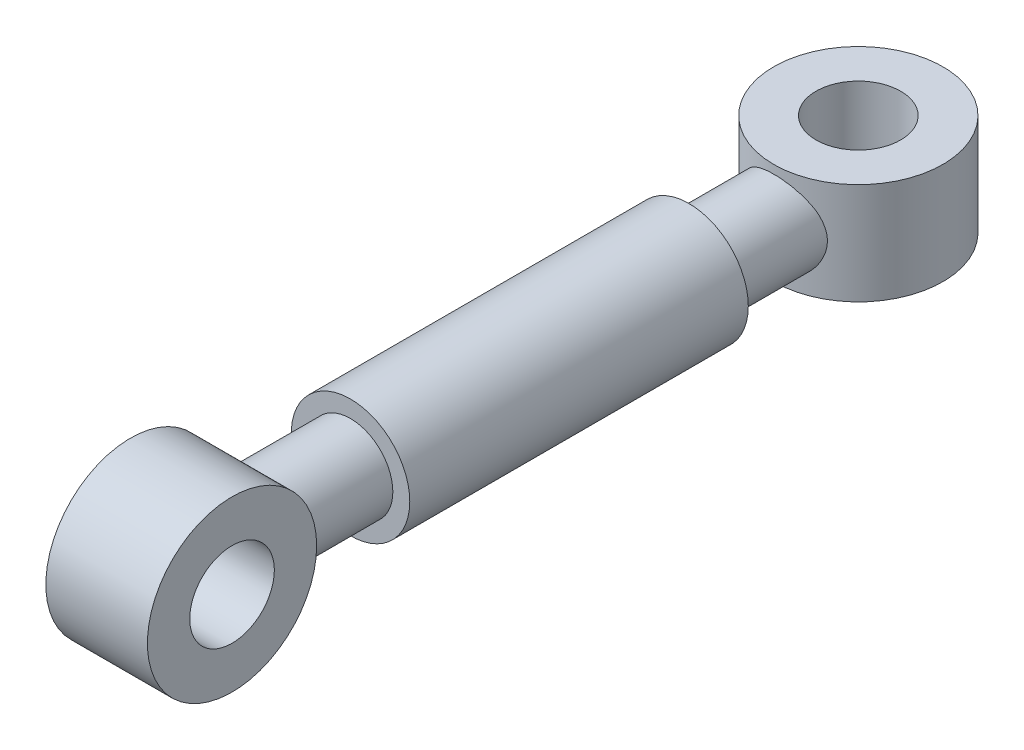
ISO-10303-21;
HEADER;
FILE_DESCRIPTION(('STEP AP214'),'2;1');
FILE_NAME('part.step','',(''),(''),'','','');
FILE_SCHEMA(('AUTOMOTIVE_DESIGN { 1 0 10303 214 1 1 1 1 }'));
ENDSEC;
DATA;
#1=APPLICATION_CONTEXT('core data for automotive mechanical design processes');
#2=APPLICATION_PROTOCOL_DEFINITION('international standard','automotive_design',2000,#1);
#3=PRODUCT_CONTEXT('',#1,'mechanical');
#4=PRODUCT('Part','Part','',(#3));
#5=PRODUCT_RELATED_PRODUCT_CATEGORY('part','',(#4));
#6=PRODUCT_DEFINITION_FORMATION('','',#4);
#7=PRODUCT_DEFINITION_CONTEXT('part definition',#1,'design');
#8=PRODUCT_DEFINITION('design','',#6,#7);
#9=PRODUCT_DEFINITION_SHAPE('','',#8);
#10=(LENGTH_UNIT() NAMED_UNIT(*) SI_UNIT(.MILLI.,.METRE.));
#11=(NAMED_UNIT(*) PLANE_ANGLE_UNIT() SI_UNIT($,.RADIAN.));
#12=(NAMED_UNIT(*) SI_UNIT($,.STERADIAN.) SOLID_ANGLE_UNIT());
#13=UNCERTAINTY_MEASURE_WITH_UNIT(LENGTH_MEASURE(1.E-05),#10,'distance_accuracy_value','');
#14=(GEOMETRIC_REPRESENTATION_CONTEXT(3) GLOBAL_UNCERTAINTY_ASSIGNED_CONTEXT((#13)) GLOBAL_UNIT_ASSIGNED_CONTEXT((#10,
#11,#12)) REPRESENTATION_CONTEXT('',''));
#15=CARTESIAN_POINT('',(0.,0.,0.));
#16=DIRECTION('',(0.,0.,1.));
#17=DIRECTION('',(1.,0.,0.));
#18=AXIS2_PLACEMENT_3D('',#15,#16,#17);
#19=CARTESIAN_POINT('',(0.,1.5,-10.));
#20=DIRECTION('',(0.,1.,0.));
#21=DIRECTION('',(0.,0.,1.));
#22=AXIS2_PLACEMENT_3D('',#19,#20,#21);
#23=PLANE('',#22);
#24=CARTESIAN_POINT('',(0.,1.5,-10.));
#25=DIRECTION('',(0.,1.,0.));
#26=DIRECTION('',(0.,0.,1.));
#27=AXIS2_PLACEMENT_3D('',#24,#25,#26);
#28=CIRCLE('',#27,2.5);
#29=CARTESIAN_POINT('',(0.,1.5,-7.5));
#30=VERTEX_POINT('',#29);
#31=EDGE_CURVE('E11',#30,#30,#28,.T.);
#32=ORIENTED_EDGE('',*,*,#31,.T.);
#33=EDGE_LOOP('',(#32));
#34=FACE_BOUND('',#33,.T.);
#35=CARTESIAN_POINT('',(0.,1.5,-10.));
#36=DIRECTION('',(0.,1.,0.));
#37=DIRECTION('',(0.,0.,1.));
#38=AXIS2_PLACEMENT_3D('',#35,#36,#37);
#39=CIRCLE('',#38,1.25);
#40=CARTESIAN_POINT('',(0.,1.5,-8.75));
#41=VERTEX_POINT('',#40);
#42=EDGE_CURVE('E62',#41,#41,#39,.T.);
#43=ORIENTED_EDGE('',*,*,#42,.F.);
#44=EDGE_LOOP('',(#43));
#45=FACE_BOUND('',#44,.T.);
#46=ADVANCED_FACE('F51',(#34,#45),#23,.T.);
#47=CARTESIAN_POINT('',(0.,-1.5,-10.));
#48=DIRECTION('',(0.,1.,0.));
#49=DIRECTION('',(0.,0.,1.));
#50=AXIS2_PLACEMENT_3D('',#47,#48,#49);
#51=PLANE('',#50);
#52=CARTESIAN_POINT('',(0.,-1.5,-10.));
#53=DIRECTION('',(0.,1.,0.));
#54=DIRECTION('',(0.,0.,1.));
#55=AXIS2_PLACEMENT_3D('',#52,#53,#54);
#56=CIRCLE('',#55,2.5);
#57=CARTESIAN_POINT('',(0.,-1.5,-7.5));
#58=VERTEX_POINT('',#57);
#59=EDGE_CURVE('E55',#58,#58,#56,.T.);
#60=ORIENTED_EDGE('',*,*,#59,.F.);
#61=EDGE_LOOP('',(#60));
#62=FACE_BOUND('',#61,.T.);
#63=CARTESIAN_POINT('',(0.,-1.5,-10.));
#64=DIRECTION('',(0.,1.,0.));
#65=DIRECTION('',(0.,0.,1.));
#66=AXIS2_PLACEMENT_3D('',#63,#64,#65);
#67=CIRCLE('',#66,1.25);
#68=CARTESIAN_POINT('',(0.,-1.5,-8.75));
#69=VERTEX_POINT('',#68);
#70=EDGE_CURVE('E64',#69,#69,#67,.T.);
#71=ORIENTED_EDGE('',*,*,#70,.T.);
#72=EDGE_LOOP('',(#71));
#73=FACE_BOUND('',#72,.T.);
#74=ADVANCED_FACE('F74',(#62,#73),#51,.F.);
#75=CARTESIAN_POINT('',(0.,1.5,-10.));
#76=DIRECTION('',(0.,-1.,0.));
#77=DIRECTION('',(0.,0.,-1.));
#78=AXIS2_PLACEMENT_3D('',#75,#76,#77);
#79=CYLINDRICAL_SURFACE('',#78,2.5);
#80=ORIENTED_EDGE('',*,*,#31,.F.);
#81=EDGE_LOOP('',(#80));
#82=FACE_BOUND('',#81,.T.);
#83=ORIENTED_EDGE('',*,*,#59,.T.);
#84=EDGE_LOOP('',(#83));
#85=FACE_BOUND('',#84,.T.);
#86=ADVANCED_FACE('F53',(#82,#85),#79,.T.);
#87=CARTESIAN_POINT('',(0.,1.5,-10.));
#88=DIRECTION('',(0.,-1.,0.));
#89=DIRECTION('',(0.,0.,-1.));
#90=AXIS2_PLACEMENT_3D('',#87,#88,#89);
#91=CYLINDRICAL_SURFACE('',#90,1.25);
#92=ORIENTED_EDGE('',*,*,#42,.T.);
#93=EDGE_LOOP('',(#92));
#94=FACE_BOUND('',#93,.T.);
#95=ORIENTED_EDGE('',*,*,#70,.F.);
#96=EDGE_LOOP('',(#95));
#97=FACE_BOUND('',#96,.T.);
#98=ADVANCED_FACE('F70',(#94,#97),#91,.F.);
#99=CLOSED_SHELL('',(#46,#74,#86,#98));
#100=MANIFOLD_SOLID_BREP('B2',#99);
#101=CARTESIAN_POINT('',(0.,0.,8.5));
#102=DIRECTION('',(0.,0.,-1.));
#103=DIRECTION('',(-1.,0.,0.));
#104=AXIS2_PLACEMENT_3D('',#101,#102,#103);
#105=CYLINDRICAL_SURFACE('',#104,1.25);
#106=CARTESIAN_POINT('',(0.,0.,5.));
#107=DIRECTION('',(0.,0.,1.));
#108=DIRECTION('',(1.,0.,0.));
#109=AXIS2_PLACEMENT_3D('',#106,#107,#108);
#110=CIRCLE('',#109,1.25);
#111=CARTESIAN_POINT('',(1.25,0.,5.));
#112=VERTEX_POINT('',#111);
#113=EDGE_CURVE('E149',#112,#112,#110,.F.);
#114=ORIENTED_EDGE('',*,*,#113,.F.);
#115=EDGE_LOOP('',(#114));
#116=FACE_BOUND('',#115,.T.);
#117=CARTESIAN_POINT('',(-1.25,0.,7.5));
#118=CARTESIAN_POINT('',(-1.24999587210062,-0.0657149536912331,7.50000358244811));
#119=CARTESIAN_POINT('',(-1.24478740859791,-0.131508249622541,7.50261886225603));
#120=CARTESIAN_POINT('',(-1.22418389957385,-0.261150294085531,7.51282304953255));
#121=CARTESIAN_POINT('',(-1.20876950875294,-0.32499510839188,7.52042140213771));
#122=CARTESIAN_POINT('',(-1.16850773922901,-0.448666931100718,7.5397965074586));
#123=CARTESIAN_POINT('',(-1.14369701968998,-0.508508503673975,7.551557010281));
#124=CARTESIAN_POINT('',(-1.08553672329382,-0.623090771008206,7.57817779355277));
#125=CARTESIAN_POINT('',(-1.05218781968893,-0.677831867487562,7.59303782958088));
#126=CARTESIAN_POINT('',(-0.975603438143377,-0.784384772202399,7.62554677177429));
#127=CARTESIAN_POINT('',(-0.931891900950447,-0.83581901390264,7.6433100109058));
#128=CARTESIAN_POINT('',(-0.836848150941208,-0.930974306083722,7.6792503719157));
#129=CARTESIAN_POINT('',(-0.785510185284449,-0.974689478883458,7.69742779738706));
#130=CARTESIAN_POINT('',(-0.671895813095772,-1.05656500056285,7.73376311003316));
#131=CARTESIAN_POINT('',(-0.609079877067608,-1.09403166943955,7.75181016287335));
#132=CARTESIAN_POINT('',(-0.477040830017231,-1.15771028361337,7.78392526534599));
#133=CARTESIAN_POINT('',(-0.407822339096563,-1.18393026870792,7.79799615491263));
#134=CARTESIAN_POINT('',(-0.269168618222596,-1.22266555273574,7.8192766620274));
#135=CARTESIAN_POINT('',(-0.199994434915757,-1.23590732135055,7.82684660520358));
#136=CARTESIAN_POINT('',(-0.0600264527756535,-1.25053374163606,7.8352263756434));
#137=CARTESIAN_POINT('',(0.0107656760889439,-1.25193011046634,7.8360428832089));
#138=CARTESIAN_POINT('',(0.142857530394211,-1.24335910896537,7.83111337178439));
#139=CARTESIAN_POINT('',(0.204280039028813,-1.23473069942103,7.82614045422483));
#140=CARTESIAN_POINT('',(0.324652386716303,-1.20867481132117,7.81154714082687));
#141=CARTESIAN_POINT('',(0.383601431631645,-1.19124452987206,7.8019252646028));
#142=CARTESIAN_POINT('',(0.499036415707074,-1.1477622254825,7.77890654484074));
#143=CARTESIAN_POINT('',(0.555432998482236,-1.12151883389499,7.76542699170002));
#144=CARTESIAN_POINT('',(0.66329286573751,-1.061302109585,7.73620744648245));
#145=CARTESIAN_POINT('',(0.714753919500111,-1.02732530476558,7.72046644024762));
#146=CARTESIAN_POINT('',(0.818151565929033,-0.947582568640985,7.68608552620893));
#147=CARTESIAN_POINT('',(0.869321091970197,-0.900868072961602,7.66733112204067));
#148=CARTESIAN_POINT('',(0.963419273238627,-0.799444473426717,7.63065470874491));
#149=CARTESIAN_POINT('',(1.00634399004235,-0.744731570717856,7.61273310051499));
#150=CARTESIAN_POINT('',(1.08460707628716,-0.62564563228981,7.57872515896295));
#151=CARTESIAN_POINT('',(1.11950059055718,-0.560941989499261,7.56276269797491));
#152=CARTESIAN_POINT('',(1.17762128630376,-0.425582769360996,7.53552648598447));
#153=CARTESIAN_POINT('',(1.20085773126896,-0.354931970331595,7.52424901320559));
#154=CARTESIAN_POINT('',(1.23309425464584,-0.215958114575877,7.50844582823205));
#155=CARTESIAN_POINT('',(1.24311404468347,-0.147926913185405,7.5034382712336));
#156=CARTESIAN_POINT('',(1.25183091391811,-0.0109744999366918,7.49908733176123));
#157=CARTESIAN_POINT('',(1.25053335704935,0.0579462748373769,7.4997412659836));
#158=CARTESIAN_POINT('',(1.23724163947656,0.189041214982492,7.50636009683199));
#159=CARTESIAN_POINT('',(1.22608433408746,0.251324260062443,7.51190942889763));
#160=CARTESIAN_POINT('',(1.19470241013114,0.373008615377396,7.52722285856476));
#161=CARTESIAN_POINT('',(1.1744767919333,0.432409607113746,7.53698742082084));
#162=CARTESIAN_POINT('',(1.12500191695854,0.548610760562082,7.56019685732913));
#163=CARTESIAN_POINT('',(1.09551118735398,0.605287996257692,7.57373897787576));
#164=CARTESIAN_POINT('',(1.02861558044245,0.713076702123651,7.60320032103614));
#165=CARTESIAN_POINT('',(0.991207331758211,0.764185787219102,7.61912055542769));
#166=CARTESIAN_POINT('',(0.905299468333908,0.864709611613317,7.6536472332817));
#167=CARTESIAN_POINT('',(0.856071414433044,0.913465097280799,7.67236393939448));
#168=CARTESIAN_POINT('',(0.75009356091337,1.00232040139155,7.70922010495157));
#169=CARTESIAN_POINT('',(0.693338601479533,1.04241423211355,7.72735915773092));
#170=CARTESIAN_POINT('',(0.570445432249611,1.11463489312212,7.76186009717415));
#171=CARTESIAN_POINT('',(0.503985917239257,1.1462818698483,7.7780933792066));
#172=CARTESIAN_POINT('',(0.365612415384349,1.19760353251725,7.80532409539842));
#173=CARTESIAN_POINT('',(0.293705591873517,1.21729364485946,7.81632827199228));
#174=CARTESIAN_POINT('',(0.15386222142319,1.2423271093121,7.83048123739167));
#175=CARTESIAN_POINT('',(0.0862071832137057,1.24886624550108,7.83428270674386));
#176=CARTESIAN_POINT('',(-0.04930883396341,1.25086144297598,7.83543306692281));
#177=CARTESIAN_POINT('',(-0.117169710924291,1.2463223082805,7.83278475465559));
#178=CARTESIAN_POINT('',(-0.244354376915019,1.22740765699033,7.82202672437469));
#179=CARTESIAN_POINT('',(-0.3038755876805,1.2140103929285,7.81446131897008));
#180=CARTESIAN_POINT('',(-0.419760149280883,1.17896919778081,7.79536229765103));
#181=CARTESIAN_POINT('',(-0.476122477614959,1.15732261394976,7.78382740537906));
#182=CARTESIAN_POINT('',(-0.588281063733258,1.10476968162585,7.7571433704434));
#183=CARTESIAN_POINT('',(-0.643784877287126,1.07333892227057,7.74180347004762));
#184=CARTESIAN_POINT('',(-0.749093170225732,1.00268871454579,7.70955835456762));
#185=CARTESIAN_POINT('',(-0.798894663148112,0.963465214048311,7.69265232756847));
#186=CARTESIAN_POINT('',(-0.897677477947019,0.872754158330802,7.65672096050859));
#187=CARTESIAN_POINT('',(-0.945823877952402,0.820355528762714,7.63768770860664));
#188=CARTESIAN_POINT('',(-1.03282872927954,0.70769350777535,7.60152809681141));
#189=CARTESIAN_POINT('',(-1.07168217428286,0.647425904070982,7.5844027673995));
#190=CARTESIAN_POINT('',(-1.13904545345276,0.519914496024934,7.55377488018621));
#191=CARTESIAN_POINT('',(-1.16748021176429,0.452624379918268,7.54029879296364));
#192=CARTESIAN_POINT('',(-1.21226020989869,0.313427626617739,7.51873323295668));
#193=CARTESIAN_POINT('',(-1.22863980853697,0.241534749528958,7.51062845783835));
#194=CARTESIAN_POINT('',(-1.24237176384481,0.14075243310423,7.50380672612921));
#195=CARTESIAN_POINT('',(-1.24522830107952,0.112702349299374,7.50238293325998));
#196=CARTESIAN_POINT('',(-1.24904333189601,0.0564396647589478,7.50047878777669));
#197=CARTESIAN_POINT('',(-1.250001773089,0.0282270595592271,7.49999846120296));
#198=CARTESIAN_POINT('',(-1.25,0.,7.5));
#199=B_SPLINE_CURVE_WITH_KNOTS('',3,(#117,#118,#119,#120,#121,#122,#123,#124,#125,#126,#127,
#128,#129,#130,#131,#132,#133,#134,#135,#136,#137,#138,#139,#140,#141,#142,#143,#144,#145,#146,
#147,#148,#149,#150,#151,#152,#153,#154,#155,#156,#157,#158,#159,#160,#161,#162,#163,#164,#165,
#166,#167,#168,#169,#170,#171,#172,#173,#174,#175,#176,#177,#178,#179,#180,#181,#182,#183,#184,
#185,#186,#187,#188,#189,#190,#191,#192,#193,#194,#195,#196,#197,#198),.UNSPECIFIED.,.T.,.F.,(4,
2,2,2,2,2,2,2,2,2,2,2,2,2,2,2,2,2,2,2,2,2,2,2,2,2,2,2,2,2,2,2,2,2,2,2,2,2,2,2,4),(0.,
0.197030321775366,0.394435187136497,0.591077694365373,0.78770470072696,0.996227198397611,
1.20490779706754,1.42977158038441,1.65447434872851,1.86572515175287,2.07676696661275,
2.26257140511651,2.44843504907098,2.63862800210609,2.82890651575277,3.04331176667348,
3.25781918248358,3.48228777768051,3.70657771140349,3.91229113089182,4.11790705639345,
4.30758633132652,4.49728652038664,4.69241070034873,4.88761813435424,5.10199513305523,
5.3165198576929,5.54143352699592,5.76605639925972,5.96911634372967,6.17208824825007,
6.35572412805228,6.53941910979598,6.73545570969518,6.93159451423697,7.15156553440623,
7.37165479220716,7.59330017078656,7.81431135781163,7.89894100172122,7.98357298143558),.UNSPECIFIED.);
#200=CARTESIAN_POINT('',(-1.25,0.,7.5));
#201=VERTEX_POINT('',#200);
#202=EDGE_CURVE('E50',#201,#201,#199,.T.);
#203=ORIENTED_EDGE('',*,*,#202,.F.);
#204=EDGE_LOOP('',(#203));
#205=FACE_BOUND('',#204,.T.);
#206=ADVANCED_FACE('F121',(#116,#205),#105,.T.);
#207=CARTESIAN_POINT('',(0.,0.,5.));
#208=DIRECTION('',(0.,0.,-1.));
#209=DIRECTION('',(-1.,0.,0.));
#210=AXIS2_PLACEMENT_3D('',#207,#208,#209);
#211=CYLINDRICAL_SURFACE('',#210,1.75);
#212=CARTESIAN_POINT('',(0.,0.,5.));
#213=DIRECTION('',(0.,0.,1.));
#214=DIRECTION('',(1.,0.,0.));
#215=AXIS2_PLACEMENT_3D('',#212,#213,#214);
#216=CIRCLE('',#215,1.75);
#217=CARTESIAN_POINT('',(1.75,0.,5.));
#218=VERTEX_POINT('',#217);
#219=EDGE_CURVE('E139',#218,#218,#216,.T.);
#220=ORIENTED_EDGE('',*,*,#219,.F.);
#221=EDGE_LOOP('',(#220));
#222=FACE_BOUND('',#221,.T.);
#223=CARTESIAN_POINT('',(0.,0.,-5.));
#224=DIRECTION('',(0.,0.,1.));
#225=DIRECTION('',(1.,0.,0.));
#226=AXIS2_PLACEMENT_3D('',#223,#224,#225);
#227=CIRCLE('',#226,1.75);
#228=CARTESIAN_POINT('',(1.75,0.,-5.));
#229=VERTEX_POINT('',#228);
#230=EDGE_CURVE('E144',#229,#229,#227,.T.);
#231=ORIENTED_EDGE('',*,*,#230,.T.);
#232=EDGE_LOOP('',(#231));
#233=FACE_BOUND('',#232,.T.);
#234=ADVANCED_FACE('F123',(#222,#233),#211,.T.);
#235=CARTESIAN_POINT('',(0.,0.,5.));
#236=DIRECTION('',(0.,0.,1.));
#237=DIRECTION('',(1.,0.,0.));
#238=AXIS2_PLACEMENT_3D('',#235,#236,#237);
#239=PLANE('',#238);
#240=ORIENTED_EDGE('',*,*,#113,.T.);
#241=EDGE_LOOP('',(#240));
#242=FACE_BOUND('',#241,.T.);
#243=ORIENTED_EDGE('',*,*,#219,.T.);
#244=EDGE_LOOP('',(#243));
#245=FACE_BOUND('',#244,.T.);
#246=ADVANCED_FACE('F198',(#242,#245),#239,.T.);
#247=CARTESIAN_POINT('',(0.,0.,-5.));
#248=DIRECTION('',(0.,0.,1.));
#249=DIRECTION('',(1.,0.,0.));
#250=AXIS2_PLACEMENT_3D('',#247,#248,#249);
#251=PLANE('',#250);
#252=CARTESIAN_POINT('',(0.,0.,-5.));
#253=DIRECTION('',(0.,0.,1.));
#254=DIRECTION('',(1.,0.,0.));
#255=AXIS2_PLACEMENT_3D('',#252,#253,#254);
#256=CIRCLE('',#255,1.25);
#257=CARTESIAN_POINT('',(1.25,0.,-5.));
#258=VERTEX_POINT('',#257);
#259=EDGE_CURVE('E134',#258,#258,#256,.F.);
#260=ORIENTED_EDGE('',*,*,#259,.F.);
#261=EDGE_LOOP('',(#260));
#262=FACE_BOUND('',#261,.T.);
#263=ORIENTED_EDGE('',*,*,#230,.F.);
#264=EDGE_LOOP('',(#263));
#265=FACE_BOUND('',#264,.T.);
#266=ADVANCED_FACE('F211',(#262,#265),#251,.F.);
#267=CARTESIAN_POINT('',(0.,0.,-8.5));
#268=DIRECTION('',(0.,0.,1.));
#269=DIRECTION('',(1.,0.,0.));
#270=AXIS2_PLACEMENT_3D('',#267,#268,#269);
#271=PLANE('',#270);
#272=CARTESIAN_POINT('',(0.,0.,-8.5));
#273=DIRECTION('',(0.,0.,1.));
#274=DIRECTION('',(1.,0.,0.));
#275=AXIS2_PLACEMENT_3D('',#272,#273,#274);
#276=CIRCLE('',#275,1.25);
#277=CARTESIAN_POINT('',(1.25,0.,-8.5));
#278=VERTEX_POINT('',#277);
#279=EDGE_CURVE('E154',#278,#278,#276,.T.);
#280=ORIENTED_EDGE('',*,*,#279,.F.);
#281=EDGE_LOOP('',(#280));
#282=FACE_BOUND('',#281,.T.);
#283=ADVANCED_FACE('F206',(#282),#271,.F.);
#284=ORIENTED_EDGE('',*,*,#279,.T.);
#285=EDGE_LOOP('',(#284));
#286=FACE_BOUND('',#285,.T.);
#287=ORIENTED_EDGE('',*,*,#259,.T.);
#288=EDGE_LOOP('',(#287));
#289=FACE_BOUND('',#288,.T.);
#290=ADVANCED_FACE('F190',(#286,#289),#105,.T.);
#291=CARTESIAN_POINT('',(1.5,0.,10.));
#292=DIRECTION('',(-1.,0.,0.));
#293=DIRECTION('',(0.,0.,1.));
#294=AXIS2_PLACEMENT_3D('',#291,#292,#293);
#295=CYLINDRICAL_SURFACE('',#294,2.5);
#296=CARTESIAN_POINT('',(-1.5,0.,10.));
#297=DIRECTION('',(1.,0.,0.));
#298=DIRECTION('',(0.,0.,-1.));
#299=AXIS2_PLACEMENT_3D('',#296,#297,#298);
#300=CIRCLE('',#299,2.5);
#301=CARTESIAN_POINT('',(-1.5,0.,7.5));
#302=VERTEX_POINT('',#301);
#303=EDGE_CURVE('E159',#302,#302,#300,.T.);
#304=ORIENTED_EDGE('',*,*,#303,.T.);
#305=EDGE_LOOP('',(#304));
#306=FACE_BOUND('',#305,.T.);
#307=CARTESIAN_POINT('',(1.5,0.,10.));
#308=DIRECTION('',(1.,0.,0.));
#309=DIRECTION('',(0.,0.,-1.));
#310=AXIS2_PLACEMENT_3D('',#307,#308,#309);
#311=CIRCLE('',#310,2.5);
#312=CARTESIAN_POINT('',(1.5,0.,7.5));
#313=VERTEX_POINT('',#312);
#314=EDGE_CURVE('E158',#313,#313,#311,.T.);
#315=ORIENTED_EDGE('',*,*,#314,.F.);
#316=EDGE_LOOP('',(#315));
#317=FACE_BOUND('',#316,.T.);
#318=ORIENTED_EDGE('',*,*,#202,.T.);
#319=EDGE_LOOP('',(#318));
#320=FACE_BOUND('',#319,.T.);
#321=ADVANCED_FACE('F181',(#306,#317,#320),#295,.T.);
#322=CARTESIAN_POINT('',(1.5,0.,10.));
#323=DIRECTION('',(1.,0.,0.));
#324=DIRECTION('',(0.,0.,-1.));
#325=AXIS2_PLACEMENT_3D('',#322,#323,#324);
#326=PLANE('',#325);
#327=ORIENTED_EDGE('',*,*,#314,.T.);
#328=EDGE_LOOP('',(#327));
#329=FACE_BOUND('',#328,.T.);
#330=CARTESIAN_POINT('',(1.5,0.,10.));
#331=DIRECTION('',(1.,0.,0.));
#332=DIRECTION('',(0.,0.,-1.));
#333=AXIS2_PLACEMENT_3D('',#330,#331,#332);
#334=CIRCLE('',#333,1.25);
#335=CARTESIAN_POINT('',(1.5,0.,8.75));
#336=VERTEX_POINT('',#335);
#337=EDGE_CURVE('E163',#336,#336,#334,.T.);
#338=ORIENTED_EDGE('',*,*,#337,.F.);
#339=EDGE_LOOP('',(#338));
#340=FACE_BOUND('',#339,.T.);
#341=ADVANCED_FACE('F178',(#329,#340),#326,.T.);
#342=CARTESIAN_POINT('',(-1.5,0.,10.));
#343=DIRECTION('',(1.,0.,0.));
#344=DIRECTION('',(0.,0.,-1.));
#345=AXIS2_PLACEMENT_3D('',#342,#343,#344);
#346=PLANE('',#345);
#347=ORIENTED_EDGE('',*,*,#303,.F.);
#348=EDGE_LOOP('',(#347));
#349=FACE_BOUND('',#348,.T.);
#350=CARTESIAN_POINT('',(-1.5,0.,10.));
#351=DIRECTION('',(1.,0.,0.));
#352=DIRECTION('',(0.,0.,-1.));
#353=AXIS2_PLACEMENT_3D('',#350,#351,#352);
#354=CIRCLE('',#353,1.25);
#355=CARTESIAN_POINT('',(-1.5,0.,8.75));
#356=VERTEX_POINT('',#355);
#357=EDGE_CURVE('E167',#356,#356,#354,.T.);
#358=ORIENTED_EDGE('',*,*,#357,.T.);
#359=EDGE_LOOP('',(#358));
#360=FACE_BOUND('',#359,.T.);
#361=ADVANCED_FACE('F180',(#349,#360),#346,.F.);
#362=CARTESIAN_POINT('',(1.5,0.,10.));
#363=DIRECTION('',(-1.,0.,0.));
#364=DIRECTION('',(0.,0.,1.));
#365=AXIS2_PLACEMENT_3D('',#362,#363,#364);
#366=CYLINDRICAL_SURFACE('',#365,1.25);
#367=ORIENTED_EDGE('',*,*,#337,.T.);
#368=EDGE_LOOP('',(#367));
#369=FACE_BOUND('',#368,.T.);
#370=ORIENTED_EDGE('',*,*,#357,.F.);
#371=EDGE_LOOP('',(#370));
#372=FACE_BOUND('',#371,.T.);
#373=ADVANCED_FACE('F175',(#369,#372),#366,.F.);
#374=CLOSED_SHELL('',(#206,#234,#246,#266,#283,#290,#321,#341,#361,#373));
#375=MANIFOLD_SOLID_BREP('B6',#374);
#376=ADVANCED_BREP_SHAPE_REPRESENTATION('',(#18,#100,#375),#14);
#377=SHAPE_DEFINITION_REPRESENTATION(#9,#376);
ENDSEC;
END-ISO-10303-21;
